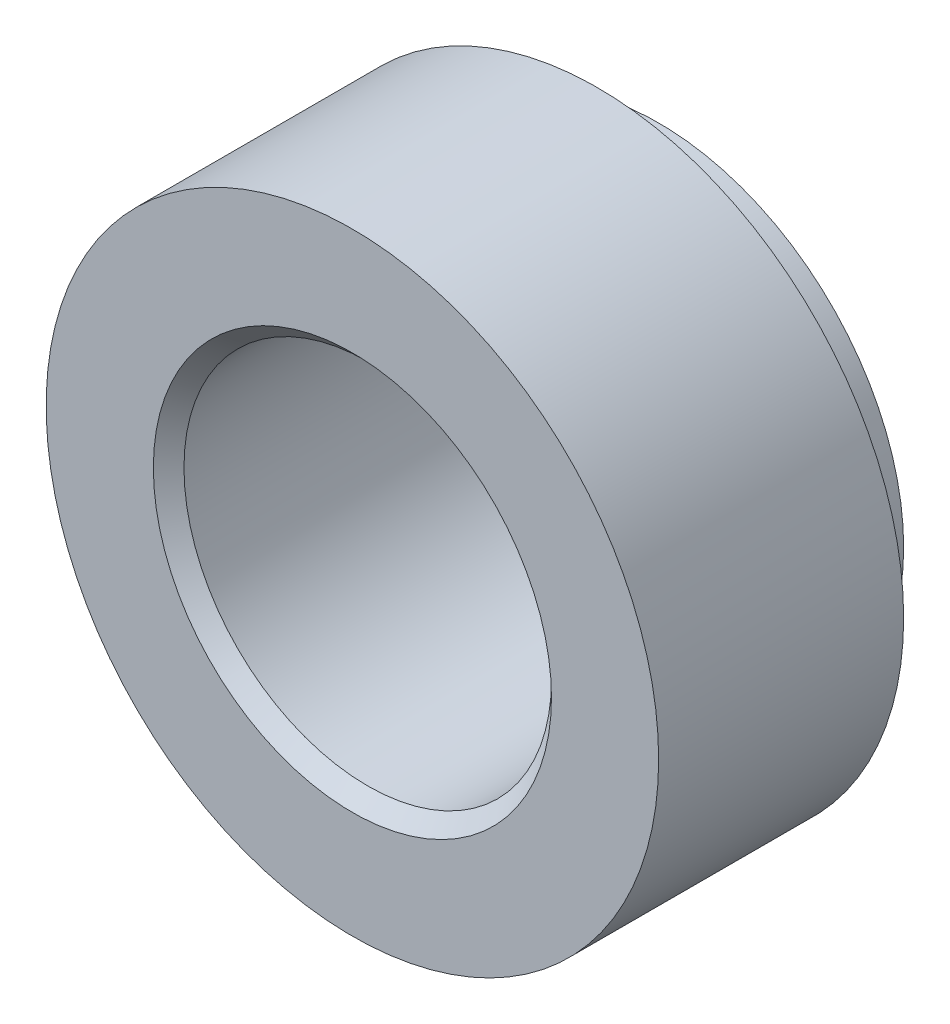
ISO-10303-21;
HEADER;
FILE_DESCRIPTION(('STEP AP214'),'2;1');
FILE_NAME('part.step','',(''),(''),'','','');
FILE_SCHEMA(('AUTOMOTIVE_DESIGN { 1 0 10303 214 1 1 1 1 }'));
ENDSEC;
DATA;
#1=APPLICATION_CONTEXT('core data for automotive mechanical design processes');
#2=APPLICATION_PROTOCOL_DEFINITION('international standard','automotive_design',2000,#1);
#3=PRODUCT_CONTEXT('',#1,'mechanical');
#4=PRODUCT('Part','Part','',(#3));
#5=PRODUCT_RELATED_PRODUCT_CATEGORY('part','',(#4));
#6=PRODUCT_DEFINITION_FORMATION('','',#4);
#7=PRODUCT_DEFINITION_CONTEXT('part definition',#1,'design');
#8=PRODUCT_DEFINITION('design','',#6,#7);
#9=PRODUCT_DEFINITION_SHAPE('','',#8);
#10=(LENGTH_UNIT() NAMED_UNIT(*) SI_UNIT(.MILLI.,.METRE.));
#11=(NAMED_UNIT(*) PLANE_ANGLE_UNIT() SI_UNIT($,.RADIAN.));
#12=(NAMED_UNIT(*) SI_UNIT($,.STERADIAN.) SOLID_ANGLE_UNIT());
#13=UNCERTAINTY_MEASURE_WITH_UNIT(LENGTH_MEASURE(1.E-05),#10,'distance_accuracy_value','');
#14=(GEOMETRIC_REPRESENTATION_CONTEXT(3) GLOBAL_UNCERTAINTY_ASSIGNED_CONTEXT((#13)) GLOBAL_UNIT_ASSIGNED_CONTEXT((#10,
#11,#12)) REPRESENTATION_CONTEXT('',''));
#15=CARTESIAN_POINT('',(0.,0.,0.));
#16=DIRECTION('',(0.,0.,1.));
#17=DIRECTION('',(1.,0.,0.));
#18=AXIS2_PLACEMENT_3D('',#15,#16,#17);
#19=CARTESIAN_POINT('',(0.,0.,0.));
#20=DIRECTION('',(0.,0.,1.));
#21=DIRECTION('',(1.,0.,0.));
#22=AXIS2_PLACEMENT_3D('',#19,#20,#21);
#23=CYLINDRICAL_SURFACE('',#22,19.05);
#24=CARTESIAN_POINT('',(0.,0.,-30.1625));
#25=DIRECTION('',(0.,0.,1.));
#26=DIRECTION('',(1.,0.,0.));
#27=AXIS2_PLACEMENT_3D('',#24,#25,#26);
#28=CIRCLE('',#27,19.05);
#29=CARTESIAN_POINT('',(19.05,0.,-30.1625));
#30=VERTEX_POINT('',#29);
#31=EDGE_CURVE('E53',#30,#30,#28,.F.);
#32=ORIENTED_EDGE('',*,*,#31,.T.);
#33=EDGE_LOOP('',(#32));
#34=FACE_BOUND('',#33,.T.);
#35=CARTESIAN_POINT('',(0.,0.,-1.58749999999999));
#36=DIRECTION('',(0.,0.,-1.));
#37=DIRECTION('',(-1.,0.,0.));
#38=AXIS2_PLACEMENT_3D('',#35,#36,#37);
#39=CIRCLE('',#38,19.05);
#40=CARTESIAN_POINT('',(-19.05,0.,-1.58749999999999));
#41=VERTEX_POINT('',#40);
#42=EDGE_CURVE('E57',#41,#41,#39,.F.);
#43=ORIENTED_EDGE('',*,*,#42,.T.);
#44=EDGE_LOOP('',(#43));
#45=FACE_BOUND('',#44,.T.);
#46=ADVANCED_FACE('F46',(#34,#45),#23,.F.);
#47=CARTESIAN_POINT('',(0.,19.05,0.));
#48=DIRECTION('',(0.,0.,-1.));
#49=DIRECTION('',(-1.,0.,0.));
#50=AXIS2_PLACEMENT_3D('',#47,#48,#49);
#51=PLANE('',#50);
#52=CARTESIAN_POINT('',(0.,0.,0.));
#53=DIRECTION('',(0.,0.,-1.));
#54=DIRECTION('',(-1.,0.,0.));
#55=AXIS2_PLACEMENT_3D('',#52,#53,#54);
#56=CIRCLE('',#55,20.6375);
#57=CARTESIAN_POINT('',(-20.6375,0.,0.));
#58=VERTEX_POINT('',#57);
#59=EDGE_CURVE('E12',#58,#58,#56,.T.);
#60=ORIENTED_EDGE('',*,*,#59,.T.);
#61=EDGE_LOOP('',(#60));
#62=FACE_BOUND('',#61,.T.);
#63=CARTESIAN_POINT('',(0.,0.,0.));
#64=DIRECTION('',(0.,0.,1.));
#65=DIRECTION('',(1.,0.,0.));
#66=AXIS2_PLACEMENT_3D('',#63,#64,#65);
#67=CIRCLE('',#66,31.75);
#68=CARTESIAN_POINT('',(31.75,0.,0.));
#69=VERTEX_POINT('',#68);
#70=EDGE_CURVE('E66',#69,#69,#67,.T.);
#71=ORIENTED_EDGE('',*,*,#70,.T.);
#72=EDGE_LOOP('',(#71));
#73=FACE_BOUND('',#72,.T.);
#74=ADVANCED_FACE('F95',(#62,#73),#51,.F.);
#75=CARTESIAN_POINT('',(0.,0.,0.));
#76=DIRECTION('',(0.,0.,1.));
#77=DIRECTION('',(1.,0.,0.));
#78=AXIS2_PLACEMENT_3D('',#75,#76,#77);
#79=CYLINDRICAL_SURFACE('',#78,31.75);
#80=ORIENTED_EDGE('',*,*,#70,.F.);
#81=EDGE_LOOP('',(#80));
#82=FACE_BOUND('',#81,.T.);
#83=CARTESIAN_POINT('',(0.,0.,-25.4));
#84=DIRECTION('',(0.,0.,1.));
#85=DIRECTION('',(1.,0.,0.));
#86=AXIS2_PLACEMENT_3D('',#83,#84,#85);
#87=CIRCLE('',#86,31.75);
#88=CARTESIAN_POINT('',(31.75,0.,-25.4));
#89=VERTEX_POINT('',#88);
#90=EDGE_CURVE('E69',#89,#89,#87,.T.);
#91=ORIENTED_EDGE('',*,*,#90,.T.);
#92=EDGE_LOOP('',(#91));
#93=FACE_BOUND('',#92,.T.);
#94=ADVANCED_FACE('F100',(#82,#93),#79,.T.);
#95=CARTESIAN_POINT('',(0.,31.75,-25.4));
#96=DIRECTION('',(0.,0.,1.));
#97=DIRECTION('',(1.,0.,0.));
#98=AXIS2_PLACEMENT_3D('',#95,#96,#97);
#99=PLANE('',#98);
#100=ORIENTED_EDGE('',*,*,#90,.F.);
#101=EDGE_LOOP('',(#100));
#102=FACE_BOUND('',#101,.T.);
#103=CARTESIAN_POINT('',(0.,0.,-25.4));
#104=DIRECTION('',(0.,0.,1.));
#105=DIRECTION('',(1.,0.,0.));
#106=AXIS2_PLACEMENT_3D('',#103,#104,#105);
#107=CIRCLE('',#106,25.4);
#108=CARTESIAN_POINT('',(25.4,0.,-25.4));
#109=VERTEX_POINT('',#108);
#110=EDGE_CURVE('E72',#109,#109,#107,.T.);
#111=ORIENTED_EDGE('',*,*,#110,.T.);
#112=EDGE_LOOP('',(#111));
#113=FACE_BOUND('',#112,.T.);
#114=ADVANCED_FACE('F91',(#102,#113),#99,.F.);
#115=CARTESIAN_POINT('',(0.,0.,0.));
#116=DIRECTION('',(0.,0.,1.));
#117=DIRECTION('',(1.,0.,0.));
#118=AXIS2_PLACEMENT_3D('',#115,#116,#117);
#119=CYLINDRICAL_SURFACE('',#118,25.4);
#120=ORIENTED_EDGE('',*,*,#110,.F.);
#121=EDGE_LOOP('',(#120));
#122=FACE_BOUND('',#121,.T.);
#123=CARTESIAN_POINT('',(0.,0.,-31.75));
#124=DIRECTION('',(0.,0.,1.));
#125=DIRECTION('',(1.,0.,0.));
#126=AXIS2_PLACEMENT_3D('',#123,#124,#125);
#127=CIRCLE('',#126,25.4);
#128=CARTESIAN_POINT('',(25.4,0.,-31.75));
#129=VERTEX_POINT('',#128);
#130=EDGE_CURVE('E75',#129,#129,#127,.T.);
#131=ORIENTED_EDGE('',*,*,#130,.T.);
#132=EDGE_LOOP('',(#131));
#133=FACE_BOUND('',#132,.T.);
#134=ADVANCED_FACE('F79',(#122,#133),#119,.T.);
#135=CARTESIAN_POINT('',(0.,25.4,-31.75));
#136=DIRECTION('',(0.,0.,1.));
#137=DIRECTION('',(1.,0.,0.));
#138=AXIS2_PLACEMENT_3D('',#135,#136,#137);
#139=PLANE('',#138);
#140=CARTESIAN_POINT('',(0.,0.,-31.75));
#141=DIRECTION('',(0.,0.,1.));
#142=DIRECTION('',(1.,0.,0.));
#143=AXIS2_PLACEMENT_3D('',#140,#141,#142);
#144=CIRCLE('',#143,20.6375);
#145=CARTESIAN_POINT('',(20.6375,0.,-31.75));
#146=VERTEX_POINT('',#145);
#147=EDGE_CURVE('E61',#146,#146,#144,.T.);
#148=ORIENTED_EDGE('',*,*,#147,.T.);
#149=EDGE_LOOP('',(#148));
#150=FACE_BOUND('',#149,.T.);
#151=ORIENTED_EDGE('',*,*,#130,.F.);
#152=EDGE_LOOP('',(#151));
#153=FACE_BOUND('',#152,.T.);
#154=ADVANCED_FACE('F81',(#150,#153),#139,.F.);
#155=CARTESIAN_POINT('',(0.,0.,-31.75));
#156=DIRECTION('',(0.,0.,-1.));
#157=DIRECTION('',(-1.,0.,0.));
#158=AXIS2_PLACEMENT_3D('',#155,#156,#157);
#159=CONICAL_SURFACE('',#158,20.6375,0.785398163397448);
#160=ORIENTED_EDGE('',*,*,#31,.F.);
#161=EDGE_LOOP('',(#160));
#162=FACE_BOUND('',#161,.T.);
#163=ORIENTED_EDGE('',*,*,#147,.F.);
#164=EDGE_LOOP('',(#163));
#165=FACE_BOUND('',#164,.T.);
#166=ADVANCED_FACE('F83',(#162,#165),#159,.F.);
#167=CARTESIAN_POINT('',(0.,0.,-1.58749999999999));
#168=DIRECTION('',(0.,0.,1.));
#169=DIRECTION('',(1.,0.,0.));
#170=AXIS2_PLACEMENT_3D('',#167,#168,#169);
#171=CONICAL_SURFACE('',#170,19.05,0.785398163397454);
#172=ORIENTED_EDGE('',*,*,#59,.F.);
#173=EDGE_LOOP('',(#172));
#174=FACE_BOUND('',#173,.T.);
#175=ORIENTED_EDGE('',*,*,#42,.F.);
#176=EDGE_LOOP('',(#175));
#177=FACE_BOUND('',#176,.T.);
#178=ADVANCED_FACE('F48',(#174,#177),#171,.F.);
#179=CLOSED_SHELL('',(#46,#74,#94,#114,#134,#154,#166,#178));
#180=MANIFOLD_SOLID_BREP('B2',#179);
#181=ADVANCED_BREP_SHAPE_REPRESENTATION('',(#18,#180),#14);
#182=SHAPE_DEFINITION_REPRESENTATION(#9,#181);
ENDSEC;
END-ISO-10303-21;
